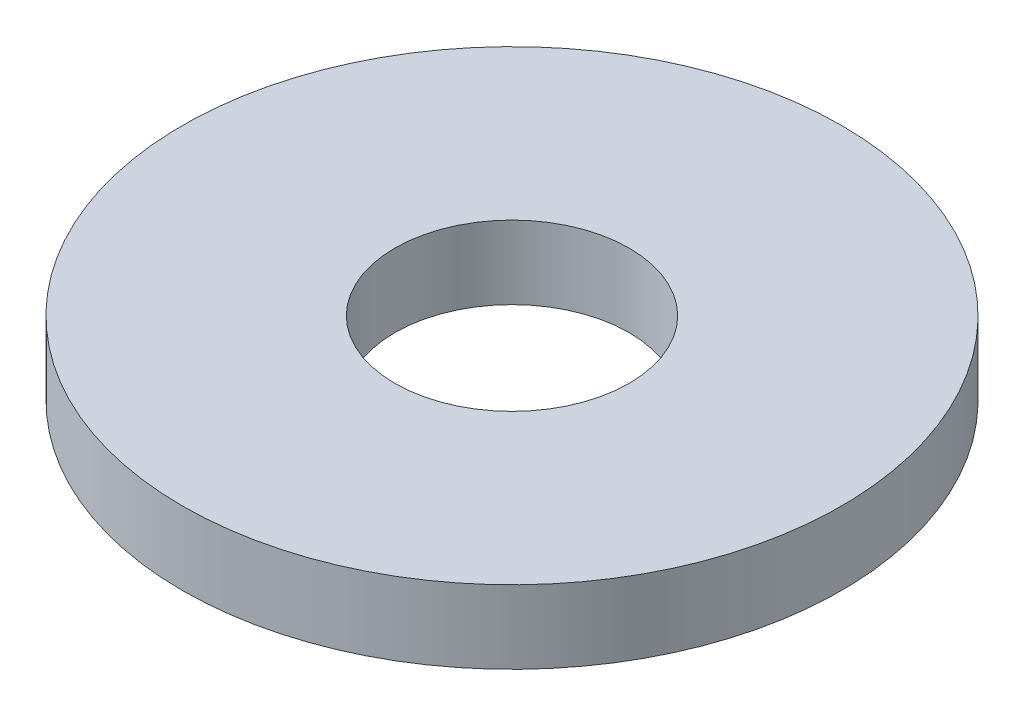
ISO-10303-21;
HEADER;
FILE_DESCRIPTION(('STEP AP214'),'2;1');
FILE_NAME('part.step','',(''),(''),'','','');
FILE_SCHEMA(('AUTOMOTIVE_DESIGN { 1 0 10303 214 1 1 1 1 }'));
ENDSEC;
DATA;
#1=APPLICATION_CONTEXT('core data for automotive mechanical design processes');
#2=APPLICATION_PROTOCOL_DEFINITION('international standard','automotive_design',2000,#1);
#3=PRODUCT_CONTEXT('',#1,'mechanical');
#4=PRODUCT('Part','Part','',(#3));
#5=PRODUCT_RELATED_PRODUCT_CATEGORY('part','',(#4));
#6=PRODUCT_DEFINITION_FORMATION('','',#4);
#7=PRODUCT_DEFINITION_CONTEXT('part definition',#1,'design');
#8=PRODUCT_DEFINITION('design','',#6,#7);
#9=PRODUCT_DEFINITION_SHAPE('','',#8);
#10=(LENGTH_UNIT() NAMED_UNIT(*) SI_UNIT(.MILLI.,.METRE.));
#11=(NAMED_UNIT(*) PLANE_ANGLE_UNIT() SI_UNIT($,.RADIAN.));
#12=(NAMED_UNIT(*) SI_UNIT($,.STERADIAN.) SOLID_ANGLE_UNIT());
#13=UNCERTAINTY_MEASURE_WITH_UNIT(LENGTH_MEASURE(1.E-05),#10,'distance_accuracy_value','');
#14=(GEOMETRIC_REPRESENTATION_CONTEXT(3) GLOBAL_UNCERTAINTY_ASSIGNED_CONTEXT((#13)) GLOBAL_UNIT_ASSIGNED_CONTEXT((#10,
#11,#12)) REPRESENTATION_CONTEXT('',''));
#15=CARTESIAN_POINT('',(0.,0.,0.));
#16=DIRECTION('',(0.,0.,1.));
#17=DIRECTION('',(1.,0.,0.));
#18=AXIS2_PLACEMENT_3D('',#15,#16,#17);
#19=CARTESIAN_POINT('',(0.,1.,0.));
#20=DIRECTION('',(0.,1.,0.));
#21=DIRECTION('',(0.,0.,1.));
#22=AXIS2_PLACEMENT_3D('',#19,#20,#21);
#23=PLANE('',#22);
#24=CARTESIAN_POINT('',(0.,1.,0.));
#25=DIRECTION('',(0.,1.,0.));
#26=DIRECTION('',(0.,0.,1.));
#27=AXIS2_PLACEMENT_3D('',#24,#25,#26);
#28=CIRCLE('',#27,4.5);
#29=CARTESIAN_POINT('',(0.,1.,4.5));
#30=VERTEX_POINT('',#29);
#31=EDGE_CURVE('E10',#30,#30,#28,.T.);
#32=ORIENTED_EDGE('',*,*,#31,.T.);
#33=EDGE_LOOP('',(#32));
#34=FACE_BOUND('',#33,.T.);
#35=CARTESIAN_POINT('',(0.,1.,0.));
#36=DIRECTION('',(0.,1.,0.));
#37=DIRECTION('',(0.,0.,1.));
#38=AXIS2_PLACEMENT_3D('',#35,#36,#37);
#39=CIRCLE('',#38,1.6);
#40=CARTESIAN_POINT('',(0.,1.,1.6));
#41=VERTEX_POINT('',#40);
#42=EDGE_CURVE('E42',#41,#41,#39,.T.);
#43=ORIENTED_EDGE('',*,*,#42,.F.);
#44=EDGE_LOOP('',(#43));
#45=FACE_BOUND('',#44,.T.);
#46=ADVANCED_FACE('F31',(#34,#45),#23,.T.);
#47=CARTESIAN_POINT('',(0.,0.,0.));
#48=DIRECTION('',(0.,1.,0.));
#49=DIRECTION('',(0.,0.,1.));
#50=AXIS2_PLACEMENT_3D('',#47,#48,#49);
#51=PLANE('',#50);
#52=CARTESIAN_POINT('',(0.,0.,0.));
#53=DIRECTION('',(0.,1.,0.));
#54=DIRECTION('',(0.,0.,1.));
#55=AXIS2_PLACEMENT_3D('',#52,#53,#54);
#56=CIRCLE('',#55,4.5);
#57=CARTESIAN_POINT('',(0.,0.,4.5));
#58=VERTEX_POINT('',#57);
#59=EDGE_CURVE('E35',#58,#58,#56,.T.);
#60=ORIENTED_EDGE('',*,*,#59,.F.);
#61=EDGE_LOOP('',(#60));
#62=FACE_BOUND('',#61,.T.);
#63=CARTESIAN_POINT('',(0.,0.,0.));
#64=DIRECTION('',(0.,1.,0.));
#65=DIRECTION('',(0.,0.,1.));
#66=AXIS2_PLACEMENT_3D('',#63,#64,#65);
#67=CIRCLE('',#66,1.6);
#68=CARTESIAN_POINT('',(0.,0.,1.6));
#69=VERTEX_POINT('',#68);
#70=EDGE_CURVE('E44',#69,#69,#67,.T.);
#71=ORIENTED_EDGE('',*,*,#70,.T.);
#72=EDGE_LOOP('',(#71));
#73=FACE_BOUND('',#72,.T.);
#74=ADVANCED_FACE('F54',(#62,#73),#51,.F.);
#75=CARTESIAN_POINT('',(0.,1.,0.));
#76=DIRECTION('',(0.,-1.,0.));
#77=DIRECTION('',(0.,0.,-1.));
#78=AXIS2_PLACEMENT_3D('',#75,#76,#77);
#79=CYLINDRICAL_SURFACE('',#78,4.5);
#80=ORIENTED_EDGE('',*,*,#31,.F.);
#81=EDGE_LOOP('',(#80));
#82=FACE_BOUND('',#81,.T.);
#83=ORIENTED_EDGE('',*,*,#59,.T.);
#84=EDGE_LOOP('',(#83));
#85=FACE_BOUND('',#84,.T.);
#86=ADVANCED_FACE('F33',(#82,#85),#79,.T.);
#87=CARTESIAN_POINT('',(0.,1.,0.));
#88=DIRECTION('',(0.,-1.,0.));
#89=DIRECTION('',(0.,0.,-1.));
#90=AXIS2_PLACEMENT_3D('',#87,#88,#89);
#91=CYLINDRICAL_SURFACE('',#90,1.6);
#92=ORIENTED_EDGE('',*,*,#42,.T.);
#93=EDGE_LOOP('',(#92));
#94=FACE_BOUND('',#93,.T.);
#95=ORIENTED_EDGE('',*,*,#70,.F.);
#96=EDGE_LOOP('',(#95));
#97=FACE_BOUND('',#96,.T.);
#98=ADVANCED_FACE('F50',(#94,#97),#91,.F.);
#99=CLOSED_SHELL('',(#46,#74,#86,#98));
#100=MANIFOLD_SOLID_BREP('B2',#99);
#101=ADVANCED_BREP_SHAPE_REPRESENTATION('',(#18,#100),#14);
#102=SHAPE_DEFINITION_REPRESENTATION(#9,#101);
ENDSEC;
END-ISO-10303-21;
